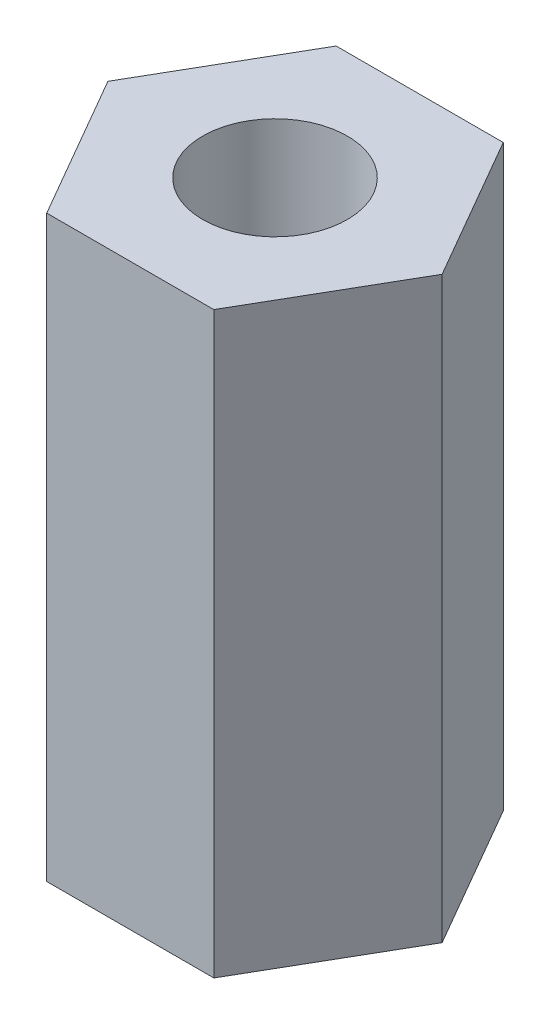
ISO-10303-21;
HEADER;
FILE_DESCRIPTION(('STEP AP214'),'2;1');
FILE_NAME('part.step','',(''),(''),'','','');
FILE_SCHEMA(('AUTOMOTIVE_DESIGN { 1 0 10303 214 1 1 1 1 }'));
ENDSEC;
DATA;
#1=APPLICATION_CONTEXT('core data for automotive mechanical design processes');
#2=APPLICATION_PROTOCOL_DEFINITION('international standard','automotive_design',2000,#1);
#3=PRODUCT_CONTEXT('',#1,'mechanical');
#4=PRODUCT('Part','Part','',(#3));
#5=PRODUCT_RELATED_PRODUCT_CATEGORY('part','',(#4));
#6=PRODUCT_DEFINITION_FORMATION('','',#4);
#7=PRODUCT_DEFINITION_CONTEXT('part definition',#1,'design');
#8=PRODUCT_DEFINITION('design','',#6,#7);
#9=PRODUCT_DEFINITION_SHAPE('','',#8);
#10=(LENGTH_UNIT() NAMED_UNIT(*) SI_UNIT(.MILLI.,.METRE.));
#11=(NAMED_UNIT(*) PLANE_ANGLE_UNIT() SI_UNIT($,.RADIAN.));
#12=(NAMED_UNIT(*) SI_UNIT($,.STERADIAN.) SOLID_ANGLE_UNIT());
#13=UNCERTAINTY_MEASURE_WITH_UNIT(LENGTH_MEASURE(1.E-05),#10,'distance_accuracy_value','');
#14=(GEOMETRIC_REPRESENTATION_CONTEXT(3) GLOBAL_UNCERTAINTY_ASSIGNED_CONTEXT((#13)) GLOBAL_UNIT_ASSIGNED_CONTEXT((#10,
#11,#12)) REPRESENTATION_CONTEXT('',''));
#15=CARTESIAN_POINT('',(0.,0.,0.));
#16=DIRECTION('',(0.,0.,1.));
#17=DIRECTION('',(1.,0.,0.));
#18=AXIS2_PLACEMENT_3D('',#15,#16,#17);
#19=CARTESIAN_POINT('',(-3.66617420935412,25.4,-6.35000000000001));
#20=DIRECTION('',(0.,1.,0.));
#21=DIRECTION('',(0.,0.,1.));
#22=AXIS2_PLACEMENT_3D('',#19,#20,#21);
#23=PLANE('',#22);
#24=DIRECTION('',(-1.,0.,0.));
#25=VECTOR('',#24,1.);
#26=CARTESIAN_POINT('',(3.66617420935413,25.4,-6.35));
#27=LINE('',#26,#25);
#28=CARTESIAN_POINT('',(3.66617420935413,25.4,-6.35));
#29=VERTEX_POINT('',#28);
#30=CARTESIAN_POINT('',(-3.66617420935412,25.4,-6.35000000000001));
#31=VERTEX_POINT('',#30);
#32=EDGE_CURVE('E126',#29,#31,#27,.T.);
#33=ORIENTED_EDGE('',*,*,#32,.T.);
#34=DIRECTION('',(-0.5,0.,0.866025403784439));
#35=VECTOR('',#34,1.);
#36=CARTESIAN_POINT('',(-3.66617420935412,25.4,-6.35000000000001));
#37=LINE('',#36,#35);
#38=CARTESIAN_POINT('',(-7.33234841870825,25.4,0.));
#39=VERTEX_POINT('',#38);
#40=EDGE_CURVE('E84',#31,#39,#37,.T.);
#41=ORIENTED_EDGE('',*,*,#40,.T.);
#42=DIRECTION('',(0.5,0.,0.866025403784438));
#43=VECTOR('',#42,1.);
#44=CARTESIAN_POINT('',(-7.33234841870825,25.4,0.));
#45=LINE('',#44,#43);
#46=CARTESIAN_POINT('',(-3.66617420935412,25.4,6.35));
#47=VERTEX_POINT('',#46);
#48=EDGE_CURVE('E97',#39,#47,#45,.T.);
#49=ORIENTED_EDGE('',*,*,#48,.T.);
#50=DIRECTION('',(1.,0.,0.));
#51=VECTOR('',#50,1.);
#52=CARTESIAN_POINT('',(-3.66617420935412,25.4,6.35));
#53=LINE('',#52,#51);
#54=CARTESIAN_POINT('',(3.66617420935413,25.4,6.35));
#55=VERTEX_POINT('',#54);
#56=EDGE_CURVE('E91',#47,#55,#53,.T.);
#57=ORIENTED_EDGE('',*,*,#56,.T.);
#58=DIRECTION('',(0.5,0.,-0.866025403784438));
#59=VECTOR('',#58,1.);
#60=CARTESIAN_POINT('',(3.66617420935413,25.4,6.35));
#61=LINE('',#60,#59);
#62=CARTESIAN_POINT('',(7.33234841870825,25.4,0.));
#63=VERTEX_POINT('',#62);
#64=EDGE_CURVE('E95',#55,#63,#61,.T.);
#65=ORIENTED_EDGE('',*,*,#64,.T.);
#66=DIRECTION('',(-0.5,0.,-0.866025403784439));
#67=VECTOR('',#66,1.);
#68=CARTESIAN_POINT('',(7.33234841870825,25.4,0.));
#69=LINE('',#68,#67);
#70=EDGE_CURVE('E47',#63,#29,#69,.T.);
#71=ORIENTED_EDGE('',*,*,#70,.T.);
#72=EDGE_LOOP('',(#33,#41,#49,#57,#65,#71));
#73=FACE_BOUND('',#72,.T.);
#74=CARTESIAN_POINT('',(0.,25.4,0.));
#75=DIRECTION('',(0.,1.,0.));
#76=DIRECTION('',(0.,0.,1.));
#77=AXIS2_PLACEMENT_3D('',#74,#75,#76);
#78=CIRCLE('',#77,3.175);
#79=CARTESIAN_POINT('',(0.,25.4,3.175));
#80=VERTEX_POINT('',#79);
#81=EDGE_CURVE('E119',#80,#80,#78,.T.);
#82=ORIENTED_EDGE('',*,*,#81,.F.);
#83=EDGE_LOOP('',(#82));
#84=FACE_BOUND('',#83,.T.);
#85=ADVANCED_FACE('F30',(#73,#84),#23,.T.);
#86=CARTESIAN_POINT('',(-3.66617420935412,0.,-6.35000000000001));
#87=DIRECTION('',(0.,1.,0.));
#88=DIRECTION('',(0.,0.,1.));
#89=AXIS2_PLACEMENT_3D('',#86,#87,#88);
#90=PLANE('',#89);
#91=DIRECTION('',(-1.,0.,0.));
#92=VECTOR('',#91,1.);
#93=CARTESIAN_POINT('',(3.66617420935413,0.,-6.35));
#94=LINE('',#93,#92);
#95=CARTESIAN_POINT('',(3.66617420935413,0.,-6.35));
#96=VERTEX_POINT('',#95);
#97=CARTESIAN_POINT('',(-3.66617420935412,0.,-6.35000000000001));
#98=VERTEX_POINT('',#97);
#99=EDGE_CURVE('E115',#96,#98,#94,.T.);
#100=ORIENTED_EDGE('',*,*,#99,.F.);
#101=DIRECTION('',(-0.5,0.,-0.866025403784439));
#102=VECTOR('',#101,1.);
#103=CARTESIAN_POINT('',(7.33234841870825,0.,0.));
#104=LINE('',#103,#102);
#105=CARTESIAN_POINT('',(7.33234841870825,0.,0.));
#106=VERTEX_POINT('',#105);
#107=EDGE_CURVE('E76',#106,#96,#104,.T.);
#108=ORIENTED_EDGE('',*,*,#107,.F.);
#109=DIRECTION('',(0.5,0.,-0.866025403784438));
#110=VECTOR('',#109,1.);
#111=CARTESIAN_POINT('',(3.66617420935413,0.,6.35));
#112=LINE('',#111,#110);
#113=CARTESIAN_POINT('',(3.66617420935413,0.,6.35));
#114=VERTEX_POINT('',#113);
#115=EDGE_CURVE('E70',#114,#106,#112,.T.);
#116=ORIENTED_EDGE('',*,*,#115,.F.);
#117=DIRECTION('',(1.,0.,0.));
#118=VECTOR('',#117,1.);
#119=CARTESIAN_POINT('',(-3.66617420935412,0.,6.35));
#120=LINE('',#119,#118);
#121=CARTESIAN_POINT('',(-3.66617420935412,0.,6.35));
#122=VERTEX_POINT('',#121);
#123=EDGE_CURVE('E105',#122,#114,#120,.T.);
#124=ORIENTED_EDGE('',*,*,#123,.F.);
#125=DIRECTION('',(0.5,0.,0.866025403784438));
#126=VECTOR('',#125,1.);
#127=CARTESIAN_POINT('',(-7.33234841870825,0.,0.));
#128=LINE('',#127,#126);
#129=CARTESIAN_POINT('',(-7.33234841870825,0.,0.));
#130=VERTEX_POINT('',#129);
#131=EDGE_CURVE('E121',#130,#122,#128,.T.);
#132=ORIENTED_EDGE('',*,*,#131,.F.);
#133=DIRECTION('',(-0.5,0.,0.866025403784439));
#134=VECTOR('',#133,1.);
#135=CARTESIAN_POINT('',(-3.66617420935412,0.,-6.35000000000001));
#136=LINE('',#135,#134);
#137=EDGE_CURVE('E118',#98,#130,#136,.T.);
#138=ORIENTED_EDGE('',*,*,#137,.F.);
#139=EDGE_LOOP('',(#100,#108,#116,#124,#132,#138));
#140=FACE_BOUND('',#139,.T.);
#141=CARTESIAN_POINT('',(0.,0.,0.));
#142=DIRECTION('',(0.,1.,0.));
#143=DIRECTION('',(0.,0.,1.));
#144=AXIS2_PLACEMENT_3D('',#141,#142,#143);
#145=CIRCLE('',#144,3.175);
#146=CARTESIAN_POINT('',(0.,0.,3.175));
#147=VERTEX_POINT('',#146);
#148=EDGE_CURVE('E219',#147,#147,#145,.T.);
#149=ORIENTED_EDGE('',*,*,#148,.T.);
#150=EDGE_LOOP('',(#149));
#151=FACE_BOUND('',#150,.T.);
#152=ADVANCED_FACE('F135',(#140,#151),#90,.F.);
#153=CARTESIAN_POINT('',(3.66617420935413,25.4,-6.35));
#154=DIRECTION('',(0.,0.,1.));
#155=DIRECTION('',(1.,0.,0.));
#156=AXIS2_PLACEMENT_3D('',#153,#154,#155);
#157=PLANE('',#156);
#158=ORIENTED_EDGE('',*,*,#99,.T.);
#159=DIRECTION('',(0.,-1.,0.));
#160=VECTOR('',#159,1.);
#161=CARTESIAN_POINT('',(-3.66617420935412,25.4,-6.35000000000001));
#162=LINE('',#161,#160);
#163=EDGE_CURVE('E11',#31,#98,#162,.T.);
#164=ORIENTED_EDGE('',*,*,#163,.F.);
#165=ORIENTED_EDGE('',*,*,#32,.F.);
#166=DIRECTION('',(0.,-1.,0.));
#167=VECTOR('',#166,1.);
#168=CARTESIAN_POINT('',(3.66617420935413,25.4,-6.35));
#169=LINE('',#168,#167);
#170=EDGE_CURVE('E111',#29,#96,#169,.T.);
#171=ORIENTED_EDGE('',*,*,#170,.T.);
#172=EDGE_LOOP('',(#158,#164,#165,#171));
#173=FACE_BOUND('',#172,.T.);
#174=ADVANCED_FACE('F32',(#173),#157,.F.);
#175=CARTESIAN_POINT('',(-3.66617420935412,25.4,-6.35000000000001));
#176=DIRECTION('',(0.866025403784438,0.,0.5));
#177=DIRECTION('',(0.5,0.,-0.866025403784439));
#178=AXIS2_PLACEMENT_3D('',#175,#176,#177);
#179=PLANE('',#178);
#180=ORIENTED_EDGE('',*,*,#137,.T.);
#181=DIRECTION('',(0.,-1.,0.));
#182=VECTOR('',#181,1.);
#183=CARTESIAN_POINT('',(-7.33234841870825,25.4,0.));
#184=LINE('',#183,#182);
#185=EDGE_CURVE('E39',#39,#130,#184,.T.);
#186=ORIENTED_EDGE('',*,*,#185,.F.);
#187=ORIENTED_EDGE('',*,*,#40,.F.);
#188=ORIENTED_EDGE('',*,*,#163,.T.);
#189=EDGE_LOOP('',(#180,#186,#187,#188));
#190=FACE_BOUND('',#189,.T.);
#191=ADVANCED_FACE('F160',(#190),#179,.F.);
#192=CARTESIAN_POINT('',(-7.33234841870825,25.4,0.));
#193=DIRECTION('',(0.866025403784438,0.,-0.5));
#194=DIRECTION('',(-0.5,0.,-0.866025403784439));
#195=AXIS2_PLACEMENT_3D('',#192,#193,#194);
#196=PLANE('',#195);
#197=ORIENTED_EDGE('',*,*,#131,.T.);
#198=DIRECTION('',(0.,-1.,0.));
#199=VECTOR('',#198,1.);
#200=CARTESIAN_POINT('',(-3.66617420935412,25.4,6.35));
#201=LINE('',#200,#199);
#202=EDGE_CURVE('E106',#47,#122,#201,.T.);
#203=ORIENTED_EDGE('',*,*,#202,.F.);
#204=ORIENTED_EDGE('',*,*,#48,.F.);
#205=ORIENTED_EDGE('',*,*,#185,.T.);
#206=EDGE_LOOP('',(#197,#203,#204,#205));
#207=FACE_BOUND('',#206,.T.);
#208=ADVANCED_FACE('F132',(#207),#196,.F.);
#209=CARTESIAN_POINT('',(-3.66617420935412,25.4,6.35));
#210=DIRECTION('',(0.,0.,-1.));
#211=DIRECTION('',(-1.,0.,0.));
#212=AXIS2_PLACEMENT_3D('',#209,#210,#211);
#213=PLANE('',#212);
#214=ORIENTED_EDGE('',*,*,#123,.T.);
#215=DIRECTION('',(0.,-1.,0.));
#216=VECTOR('',#215,1.);
#217=CARTESIAN_POINT('',(3.66617420935413,25.4,6.35));
#218=LINE('',#217,#216);
#219=EDGE_CURVE('E102',#55,#114,#218,.T.);
#220=ORIENTED_EDGE('',*,*,#219,.F.);
#221=ORIENTED_EDGE('',*,*,#56,.F.);
#222=ORIENTED_EDGE('',*,*,#202,.T.);
#223=EDGE_LOOP('',(#214,#220,#221,#222));
#224=FACE_BOUND('',#223,.T.);
#225=ADVANCED_FACE('F103',(#224),#213,.F.);
#226=CARTESIAN_POINT('',(3.66617420935413,25.4,6.35));
#227=DIRECTION('',(-0.866025403784438,0.,-0.5));
#228=DIRECTION('',(-0.5,0.,0.866025403784438));
#229=AXIS2_PLACEMENT_3D('',#226,#227,#228);
#230=PLANE('',#229);
#231=ORIENTED_EDGE('',*,*,#115,.T.);
#232=DIRECTION('',(0.,-1.,0.));
#233=VECTOR('',#232,1.);
#234=CARTESIAN_POINT('',(7.33234841870825,25.4,0.));
#235=LINE('',#234,#233);
#236=EDGE_CURVE('E107',#63,#106,#235,.T.);
#237=ORIENTED_EDGE('',*,*,#236,.F.);
#238=ORIENTED_EDGE('',*,*,#64,.F.);
#239=ORIENTED_EDGE('',*,*,#219,.T.);
#240=EDGE_LOOP('',(#231,#237,#238,#239));
#241=FACE_BOUND('',#240,.T.);
#242=ADVANCED_FACE('F109',(#241),#230,.F.);
#243=CARTESIAN_POINT('',(7.33234841870825,25.4,0.));
#244=DIRECTION('',(-0.866025403784439,0.,0.5));
#245=DIRECTION('',(0.5,0.,0.866025403784439));
#246=AXIS2_PLACEMENT_3D('',#243,#244,#245);
#247=PLANE('',#246);
#248=ORIENTED_EDGE('',*,*,#107,.T.);
#249=ORIENTED_EDGE('',*,*,#170,.F.);
#250=ORIENTED_EDGE('',*,*,#70,.F.);
#251=ORIENTED_EDGE('',*,*,#236,.T.);
#252=EDGE_LOOP('',(#248,#249,#250,#251));
#253=FACE_BOUND('',#252,.T.);
#254=ADVANCED_FACE('F140',(#253),#247,.F.);
#255=CARTESIAN_POINT('',(0.,25.4,0.));
#256=DIRECTION('',(0.,-1.,0.));
#257=DIRECTION('',(0.,0.,-1.));
#258=AXIS2_PLACEMENT_3D('',#255,#256,#257);
#259=CYLINDRICAL_SURFACE('',#258,3.175);
#260=ORIENTED_EDGE('',*,*,#81,.T.);
#261=EDGE_LOOP('',(#260));
#262=FACE_BOUND('',#261,.T.);
#263=ORIENTED_EDGE('',*,*,#148,.F.);
#264=EDGE_LOOP('',(#263));
#265=FACE_BOUND('',#264,.T.);
#266=ADVANCED_FACE('F142',(#262,#265),#259,.F.);
#267=CLOSED_SHELL('',(#85,#152,#174,#191,#208,#225,#242,#254,#266));
#268=MANIFOLD_SOLID_BREP('B2',#267);
#269=ADVANCED_BREP_SHAPE_REPRESENTATION('',(#18,#268),#14);
#270=SHAPE_DEFINITION_REPRESENTATION(#9,#269);
ENDSEC;
END-ISO-10303-21;
